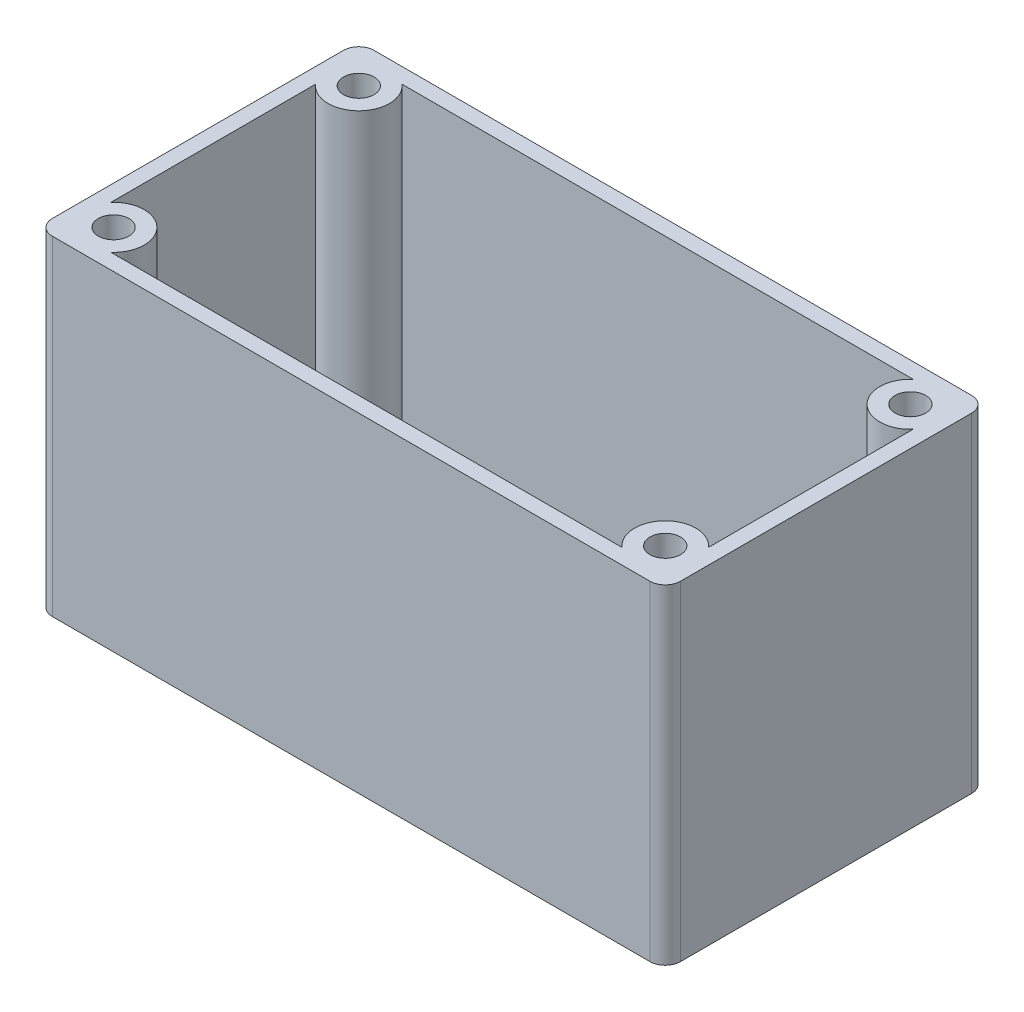
ISO-10303-21;
HEADER;
FILE_DESCRIPTION(('STEP AP214'),'2;1');
FILE_NAME('part.step','',(''),(''),'','','');
FILE_SCHEMA(('AUTOMOTIVE_DESIGN { 1 0 10303 214 1 1 1 1 }'));
ENDSEC;
DATA;
#1=APPLICATION_CONTEXT('core data for automotive mechanical design processes');
#2=APPLICATION_PROTOCOL_DEFINITION('international standard','automotive_design',2000,#1);
#3=PRODUCT_CONTEXT('',#1,'mechanical');
#4=PRODUCT('Part','Part','',(#3));
#5=PRODUCT_RELATED_PRODUCT_CATEGORY('part','',(#4));
#6=PRODUCT_DEFINITION_FORMATION('','',#4);
#7=PRODUCT_DEFINITION_CONTEXT('part definition',#1,'design');
#8=PRODUCT_DEFINITION('design','',#6,#7);
#9=PRODUCT_DEFINITION_SHAPE('','',#8);
#10=(LENGTH_UNIT() NAMED_UNIT(*) SI_UNIT(.MILLI.,.METRE.));
#11=(NAMED_UNIT(*) PLANE_ANGLE_UNIT() SI_UNIT($,.RADIAN.));
#12=(NAMED_UNIT(*) SI_UNIT($,.STERADIAN.) SOLID_ANGLE_UNIT());
#13=UNCERTAINTY_MEASURE_WITH_UNIT(LENGTH_MEASURE(1.E-05),#10,'distance_accuracy_value','');
#14=(GEOMETRIC_REPRESENTATION_CONTEXT(3) GLOBAL_UNCERTAINTY_ASSIGNED_CONTEXT((#13)) GLOBAL_UNIT_ASSIGNED_CONTEXT((#10,
#11,#12)) REPRESENTATION_CONTEXT('',''));
#15=CARTESIAN_POINT('',(0.,0.,0.));
#16=DIRECTION('',(0.,0.,1.));
#17=DIRECTION('',(1.,0.,0.));
#18=AXIS2_PLACEMENT_3D('',#15,#16,#17);
#19=CARTESIAN_POINT('',(1.,21.5,-20.));
#20=DIRECTION('',(0.,-1.,0.));
#21=DIRECTION('',(0.,0.,-1.));
#22=AXIS2_PLACEMENT_3D('',#19,#20,#21);
#23=PLANE('',#22);
#24=CARTESIAN_POINT('',(2.5,21.5,-18.5));
#25=DIRECTION('',(0.,1.,0.));
#26=DIRECTION('',(0.,0.,1.));
#27=AXIS2_PLACEMENT_3D('',#24,#25,#26);
#28=CIRCLE('',#27,1.);
#29=CARTESIAN_POINT('',(2.5,21.5,-17.5));
#30=VERTEX_POINT('',#29);
#31=EDGE_CURVE('E213',#30,#30,#28,.T.);
#32=ORIENTED_EDGE('',*,*,#31,.F.);
#33=EDGE_LOOP('',(#32));
#34=FACE_BOUND('',#33,.T.);
#35=CARTESIAN_POINT('',(1.,21.5,-20.));
#36=DIRECTION('',(0.,1.,0.));
#37=DIRECTION('',(0.,0.,-1.));
#38=AXIS2_PLACEMENT_3D('',#35,#36,#37);
#39=CIRCLE('',#38,1.);
#40=CARTESIAN_POINT('',(1.00000000000001,21.5,-21.));
#41=VERTEX_POINT('',#40);
#42=CARTESIAN_POINT('',(0.,21.5,-20.));
#43=VERTEX_POINT('',#42);
#44=EDGE_CURVE('E219',#41,#43,#39,.T.);
#45=ORIENTED_EDGE('',*,*,#44,.T.);
#46=DIRECTION('',(0.,0.,1.));
#47=VECTOR('',#46,1.);
#48=CARTESIAN_POINT('',(0.,21.5,-1.00000000000001));
#49=LINE('',#48,#47);
#50=CARTESIAN_POINT('',(0.,21.5,-1.00000000000001));
#51=VERTEX_POINT('',#50);
#52=EDGE_CURVE('E222',#43,#51,#49,.T.);
#53=ORIENTED_EDGE('',*,*,#52,.T.);
#54=CARTESIAN_POINT('',(1.,21.5,-1.));
#55=DIRECTION('',(0.,1.,0.));
#56=DIRECTION('',(0.,0.,-1.));
#57=AXIS2_PLACEMENT_3D('',#54,#55,#56);
#58=CIRCLE('',#57,1.);
#59=CARTESIAN_POINT('',(1.00000000000001,21.5,0.));
#60=VERTEX_POINT('',#59);
#61=EDGE_CURVE('E225',#51,#60,#58,.T.);
#62=ORIENTED_EDGE('',*,*,#61,.T.);
#63=DIRECTION('',(1.,0.,0.));
#64=VECTOR('',#63,1.);
#65=CARTESIAN_POINT('',(1.00000000000001,21.5,0.));
#66=LINE('',#65,#64);
#67=CARTESIAN_POINT('',(40.,21.5,0.));
#68=VERTEX_POINT('',#67);
#69=EDGE_CURVE('E227',#60,#68,#66,.T.);
#70=ORIENTED_EDGE('',*,*,#69,.T.);
#71=CARTESIAN_POINT('',(40.,21.5,-1.));
#72=DIRECTION('',(0.,1.,0.));
#73=DIRECTION('',(0.,0.,1.));
#74=AXIS2_PLACEMENT_3D('',#71,#72,#73);
#75=CIRCLE('',#74,1.);
#76=CARTESIAN_POINT('',(41.,21.5,-1.00000000000001));
#77=VERTEX_POINT('',#76);
#78=EDGE_CURVE('E229',#68,#77,#75,.T.);
#79=ORIENTED_EDGE('',*,*,#78,.T.);
#80=DIRECTION('',(0.,0.,-1.));
#81=VECTOR('',#80,1.);
#82=CARTESIAN_POINT('',(41.,21.5,-1.00000000000001));
#83=LINE('',#82,#81);
#84=CARTESIAN_POINT('',(41.,21.5,-20.));
#85=VERTEX_POINT('',#84);
#86=EDGE_CURVE('E231',#77,#85,#83,.T.);
#87=ORIENTED_EDGE('',*,*,#86,.T.);
#88=CARTESIAN_POINT('',(40.,21.5,-20.));
#89=DIRECTION('',(0.,1.,0.));
#90=DIRECTION('',(0.,0.,-1.));
#91=AXIS2_PLACEMENT_3D('',#88,#89,#90);
#92=CIRCLE('',#91,1.);
#93=CARTESIAN_POINT('',(40.,21.5,-21.));
#94=VERTEX_POINT('',#93);
#95=EDGE_CURVE('E233',#85,#94,#92,.T.);
#96=ORIENTED_EDGE('',*,*,#95,.T.);
#97=DIRECTION('',(-1.,0.,0.));
#98=VECTOR('',#97,1.);
#99=CARTESIAN_POINT('',(1.00000000000001,21.5,-21.));
#100=LINE('',#99,#98);
#101=EDGE_CURVE('E235',#94,#41,#100,.T.);
#102=ORIENTED_EDGE('',*,*,#101,.T.);
#103=EDGE_LOOP('',(#45,#53,#62,#70,#79,#87,#96,#102));
#104=FACE_BOUND('',#103,.T.);
#105=CARTESIAN_POINT('',(2.5,21.5,-18.5));
#106=DIRECTION('',(0.,-1.,0.));
#107=DIRECTION('',(0.,0.,1.));
#108=AXIS2_PLACEMENT_3D('',#105,#106,#107);
#109=CIRCLE('',#108,2.);
#110=CARTESIAN_POINT('',(3.8228756555323,21.5,-20.));
#111=VERTEX_POINT('',#110);
#112=CARTESIAN_POINT('',(1.,21.5,-17.1771243444677));
#113=VERTEX_POINT('',#112);
#114=EDGE_CURVE('E145',#111,#113,#109,.T.);
#115=ORIENTED_EDGE('',*,*,#114,.F.);
#116=DIRECTION('',(-1.,0.,0.));
#117=VECTOR('',#116,1.);
#118=CARTESIAN_POINT('',(3.8228756555323,21.5,-20.));
#119=LINE('',#118,#117);
#120=CARTESIAN_POINT('',(37.1771243444677,21.5,-20.));
#121=VERTEX_POINT('',#120);
#122=EDGE_CURVE('E180',#121,#111,#119,.T.);
#123=ORIENTED_EDGE('',*,*,#122,.F.);
#124=CARTESIAN_POINT('',(38.5,21.5,-18.5));
#125=DIRECTION('',(0.,-1.,0.));
#126=DIRECTION('',(0.,0.,1.));
#127=AXIS2_PLACEMENT_3D('',#124,#125,#126);
#128=CIRCLE('',#127,1.99999999999999);
#129=CARTESIAN_POINT('',(40.,21.5,-17.1771243444677));
#130=VERTEX_POINT('',#129);
#131=EDGE_CURVE('E178',#130,#121,#128,.T.);
#132=ORIENTED_EDGE('',*,*,#131,.F.);
#133=DIRECTION('',(0.,0.,-1.));
#134=VECTOR('',#133,1.);
#135=CARTESIAN_POINT('',(40.,21.5,-3.82287565553248));
#136=LINE('',#135,#134);
#137=CARTESIAN_POINT('',(40.,21.5,-3.82287565553248));
#138=VERTEX_POINT('',#137);
#139=EDGE_CURVE('E176',#138,#130,#136,.T.);
#140=ORIENTED_EDGE('',*,*,#139,.F.);
#141=CARTESIAN_POINT('',(38.5000000000002,21.5,-2.5));
#142=DIRECTION('',(0.,-1.,0.));
#143=DIRECTION('',(0.,0.,1.));
#144=AXIS2_PLACEMENT_3D('',#141,#142,#143);
#145=CIRCLE('',#144,2.);
#146=CARTESIAN_POINT('',(37.1771243444679,21.5,-1.00000000000001));
#147=VERTEX_POINT('',#146);
#148=EDGE_CURVE('E174',#147,#138,#145,.T.);
#149=ORIENTED_EDGE('',*,*,#148,.F.);
#150=DIRECTION('',(1.,0.,0.));
#151=VECTOR('',#150,1.);
#152=CARTESIAN_POINT('',(3.82287565553246,21.5,-1.));
#153=LINE('',#152,#151);
#154=CARTESIAN_POINT('',(3.82287565553246,21.5,-1.));
#155=VERTEX_POINT('',#154);
#156=EDGE_CURVE('E169',#155,#147,#153,.T.);
#157=ORIENTED_EDGE('',*,*,#156,.F.);
#158=CARTESIAN_POINT('',(2.50000000000017,21.5,-2.5));
#159=DIRECTION('',(0.,-1.,0.));
#160=DIRECTION('',(0.,0.,1.));
#161=AXIS2_PLACEMENT_3D('',#158,#159,#160);
#162=CIRCLE('',#161,2.);
#163=CARTESIAN_POINT('',(1.00000000000001,21.5,-3.82287565553212));
#164=VERTEX_POINT('',#163);
#165=EDGE_CURVE('E167',#164,#155,#162,.T.);
#166=ORIENTED_EDGE('',*,*,#165,.F.);
#167=DIRECTION('',(0.,0.,1.));
#168=VECTOR('',#167,1.);
#169=CARTESIAN_POINT('',(1.00000000000001,21.5,-3.82287565553212));
#170=LINE('',#169,#168);
#171=EDGE_CURVE('E153',#113,#164,#170,.T.);
#172=ORIENTED_EDGE('',*,*,#171,.F.);
#173=EDGE_LOOP('',(#115,#123,#132,#140,#149,#157,#166,#172));
#174=FACE_BOUND('',#173,.T.);
#175=CARTESIAN_POINT('',(38.5,21.5,-18.5));
#176=DIRECTION('',(0.,1.,0.));
#177=DIRECTION('',(0.,0.,1.));
#178=AXIS2_PLACEMENT_3D('',#175,#176,#177);
#179=CIRCLE('',#178,0.999999999999998);
#180=CARTESIAN_POINT('',(38.5,21.5,-17.5));
#181=VERTEX_POINT('',#180);
#182=EDGE_CURVE('E183',#181,#181,#179,.T.);
#183=ORIENTED_EDGE('',*,*,#182,.F.);
#184=EDGE_LOOP('',(#183));
#185=FACE_BOUND('',#184,.T.);
#186=CARTESIAN_POINT('',(38.5000000000002,21.5,-2.5));
#187=DIRECTION('',(0.,1.,0.));
#188=DIRECTION('',(0.,0.,1.));
#189=AXIS2_PLACEMENT_3D('',#186,#187,#188);
#190=CIRCLE('',#189,0.999999999999998);
#191=CARTESIAN_POINT('',(38.5000000000002,21.5,-1.5));
#192=VERTEX_POINT('',#191);
#193=EDGE_CURVE('E396',#192,#192,#190,.T.);
#194=ORIENTED_EDGE('',*,*,#193,.F.);
#195=EDGE_LOOP('',(#194));
#196=FACE_BOUND('',#195,.T.);
#197=CARTESIAN_POINT('',(2.50000000000017,21.5,-2.5));
#198=DIRECTION('',(0.,1.,0.));
#199=DIRECTION('',(0.,0.,1.));
#200=AXIS2_PLACEMENT_3D('',#197,#198,#199);
#201=CIRCLE('',#200,1.);
#202=CARTESIAN_POINT('',(2.50000000000017,21.5,-1.5));
#203=VERTEX_POINT('',#202);
#204=EDGE_CURVE('E387',#203,#203,#201,.T.);
#205=ORIENTED_EDGE('',*,*,#204,.F.);
#206=EDGE_LOOP('',(#205));
#207=FACE_BOUND('',#206,.T.);
#208=ADVANCED_FACE('F32',(#34,#104,#174,#185,#196,#207),#23,.F.);
#209=CARTESIAN_POINT('',(1.,0.,-20.));
#210=DIRECTION('',(0.,-1.,0.));
#211=DIRECTION('',(0.,0.,-1.));
#212=AXIS2_PLACEMENT_3D('',#209,#210,#211);
#213=PLANE('',#212);
#214=CARTESIAN_POINT('',(38.5000000000002,0.,-2.5));
#215=DIRECTION('',(0.,1.,0.));
#216=DIRECTION('',(0.,0.,1.));
#217=AXIS2_PLACEMENT_3D('',#214,#215,#216);
#218=CIRCLE('',#217,0.999999999999998);
#219=CARTESIAN_POINT('',(38.5000000000002,0.,-1.5));
#220=VERTEX_POINT('',#219);
#221=EDGE_CURVE('E393',#220,#220,#218,.T.);
#222=ORIENTED_EDGE('',*,*,#221,.T.);
#223=EDGE_LOOP('',(#222));
#224=FACE_BOUND('',#223,.T.);
#225=DIRECTION('',(-1.,0.,0.));
#226=VECTOR('',#225,1.);
#227=CARTESIAN_POINT('',(3.8228756555323,0.,-20.));
#228=LINE('',#227,#226);
#229=CARTESIAN_POINT('',(37.1771243444677,0.,-20.));
#230=VERTEX_POINT('',#229);
#231=CARTESIAN_POINT('',(3.8228756555323,0.,-20.));
#232=VERTEX_POINT('',#231);
#233=EDGE_CURVE('E154',#230,#232,#228,.T.);
#234=ORIENTED_EDGE('',*,*,#233,.T.);
#235=CARTESIAN_POINT('',(2.5,0.,-18.5));
#236=DIRECTION('',(0.,-1.,0.));
#237=DIRECTION('',(0.,0.,1.));
#238=AXIS2_PLACEMENT_3D('',#235,#236,#237);
#239=CIRCLE('',#238,2.);
#240=CARTESIAN_POINT('',(1.,0.,-17.1771243444677));
#241=VERTEX_POINT('',#240);
#242=EDGE_CURVE('E55',#232,#241,#239,.T.);
#243=ORIENTED_EDGE('',*,*,#242,.T.);
#244=DIRECTION('',(0.,0.,1.));
#245=VECTOR('',#244,1.);
#246=CARTESIAN_POINT('',(1.00000000000001,0.,-3.82287565553212));
#247=LINE('',#246,#245);
#248=CARTESIAN_POINT('',(1.00000000000001,0.,-3.82287565553212));
#249=VERTEX_POINT('',#248);
#250=EDGE_CURVE('E160',#241,#249,#247,.T.);
#251=ORIENTED_EDGE('',*,*,#250,.T.);
#252=CARTESIAN_POINT('',(2.50000000000017,0.,-2.5));
#253=DIRECTION('',(0.,-1.,0.));
#254=DIRECTION('',(0.,0.,1.));
#255=AXIS2_PLACEMENT_3D('',#252,#253,#254);
#256=CIRCLE('',#255,2.);
#257=CARTESIAN_POINT('',(3.82287565553246,0.,-1.));
#258=VERTEX_POINT('',#257);
#259=EDGE_CURVE('E185',#249,#258,#256,.T.);
#260=ORIENTED_EDGE('',*,*,#259,.T.);
#261=DIRECTION('',(1.,0.,0.));
#262=VECTOR('',#261,1.);
#263=CARTESIAN_POINT('',(3.82287565553246,0.,-1.));
#264=LINE('',#263,#262);
#265=CARTESIAN_POINT('',(37.1771243444679,0.,-1.00000000000001));
#266=VERTEX_POINT('',#265);
#267=EDGE_CURVE('E188',#258,#266,#264,.T.);
#268=ORIENTED_EDGE('',*,*,#267,.T.);
#269=CARTESIAN_POINT('',(38.5000000000002,0.,-2.5));
#270=DIRECTION('',(0.,-1.,0.));
#271=DIRECTION('',(0.,0.,1.));
#272=AXIS2_PLACEMENT_3D('',#269,#270,#271);
#273=CIRCLE('',#272,2.);
#274=CARTESIAN_POINT('',(40.,0.,-3.82287565553248));
#275=VERTEX_POINT('',#274);
#276=EDGE_CURVE('E191',#266,#275,#273,.T.);
#277=ORIENTED_EDGE('',*,*,#276,.T.);
#278=DIRECTION('',(0.,0.,-1.));
#279=VECTOR('',#278,1.);
#280=CARTESIAN_POINT('',(40.,0.,-3.82287565553248));
#281=LINE('',#280,#279);
#282=CARTESIAN_POINT('',(40.,0.,-17.1771243444677));
#283=VERTEX_POINT('',#282);
#284=EDGE_CURVE('E194',#275,#283,#281,.T.);
#285=ORIENTED_EDGE('',*,*,#284,.T.);
#286=CARTESIAN_POINT('',(38.5,0.,-18.5));
#287=DIRECTION('',(0.,-1.,0.));
#288=DIRECTION('',(0.,0.,1.));
#289=AXIS2_PLACEMENT_3D('',#286,#287,#288);
#290=CIRCLE('',#289,1.99999999999999);
#291=EDGE_CURVE('E197',#283,#230,#290,.T.);
#292=ORIENTED_EDGE('',*,*,#291,.T.);
#293=EDGE_LOOP('',(#234,#243,#251,#260,#268,#277,#285,#292));
#294=FACE_BOUND('',#293,.T.);
#295=CARTESIAN_POINT('',(2.5,0.,-18.5));
#296=DIRECTION('',(0.,1.,0.));
#297=DIRECTION('',(0.,0.,1.));
#298=AXIS2_PLACEMENT_3D('',#295,#296,#297);
#299=CIRCLE('',#298,1.);
#300=CARTESIAN_POINT('',(2.5,0.,-17.5));
#301=VERTEX_POINT('',#300);
#302=EDGE_CURVE('E161',#301,#301,#299,.T.);
#303=ORIENTED_EDGE('',*,*,#302,.T.);
#304=EDGE_LOOP('',(#303));
#305=FACE_BOUND('',#304,.T.);
#306=CARTESIAN_POINT('',(1.,0.,-20.));
#307=DIRECTION('',(0.,1.,0.));
#308=DIRECTION('',(0.,0.,-1.));
#309=AXIS2_PLACEMENT_3D('',#306,#307,#308);
#310=CIRCLE('',#309,1.);
#311=CARTESIAN_POINT('',(1.00000000000001,0.,-21.));
#312=VERTEX_POINT('',#311);
#313=CARTESIAN_POINT('',(0.,0.,-20.));
#314=VERTEX_POINT('',#313);
#315=EDGE_CURVE('E216',#312,#314,#310,.T.);
#316=ORIENTED_EDGE('',*,*,#315,.F.);
#317=DIRECTION('',(-1.,0.,0.));
#318=VECTOR('',#317,1.);
#319=CARTESIAN_POINT('',(1.00000000000001,0.,-21.));
#320=LINE('',#319,#318);
#321=CARTESIAN_POINT('',(40.,0.,-21.));
#322=VERTEX_POINT('',#321);
#323=EDGE_CURVE('E223',#322,#312,#320,.T.);
#324=ORIENTED_EDGE('',*,*,#323,.F.);
#325=CARTESIAN_POINT('',(40.,0.,-20.));
#326=DIRECTION('',(0.,1.,0.));
#327=DIRECTION('',(0.,0.,-1.));
#328=AXIS2_PLACEMENT_3D('',#325,#326,#327);
#329=CIRCLE('',#328,1.);
#330=CARTESIAN_POINT('',(41.,0.,-20.));
#331=VERTEX_POINT('',#330);
#332=EDGE_CURVE('E250',#331,#322,#329,.T.);
#333=ORIENTED_EDGE('',*,*,#332,.F.);
#334=DIRECTION('',(0.,0.,-1.));
#335=VECTOR('',#334,1.);
#336=CARTESIAN_POINT('',(41.,0.,-1.00000000000001));
#337=LINE('',#336,#335);
#338=CARTESIAN_POINT('',(41.,0.,-1.00000000000001));
#339=VERTEX_POINT('',#338);
#340=EDGE_CURVE('E248',#339,#331,#337,.T.);
#341=ORIENTED_EDGE('',*,*,#340,.F.);
#342=CARTESIAN_POINT('',(40.,0.,-1.));
#343=DIRECTION('',(0.,1.,0.));
#344=DIRECTION('',(0.,0.,1.));
#345=AXIS2_PLACEMENT_3D('',#342,#343,#344);
#346=CIRCLE('',#345,1.);
#347=CARTESIAN_POINT('',(40.,0.,0.));
#348=VERTEX_POINT('',#347);
#349=EDGE_CURVE('E246',#348,#339,#346,.T.);
#350=ORIENTED_EDGE('',*,*,#349,.F.);
#351=DIRECTION('',(1.,0.,0.));
#352=VECTOR('',#351,1.);
#353=CARTESIAN_POINT('',(1.00000000000001,0.,0.));
#354=LINE('',#353,#352);
#355=CARTESIAN_POINT('',(1.00000000000001,0.,0.));
#356=VERTEX_POINT('',#355);
#357=EDGE_CURVE('E244',#356,#348,#354,.T.);
#358=ORIENTED_EDGE('',*,*,#357,.F.);
#359=CARTESIAN_POINT('',(1.,0.,-1.));
#360=DIRECTION('',(0.,1.,0.));
#361=DIRECTION('',(0.,0.,-1.));
#362=AXIS2_PLACEMENT_3D('',#359,#360,#361);
#363=CIRCLE('',#362,1.);
#364=CARTESIAN_POINT('',(0.,0.,-1.00000000000001));
#365=VERTEX_POINT('',#364);
#366=EDGE_CURVE('E242',#365,#356,#363,.T.);
#367=ORIENTED_EDGE('',*,*,#366,.F.);
#368=DIRECTION('',(0.,0.,1.));
#369=VECTOR('',#368,1.);
#370=CARTESIAN_POINT('',(0.,0.,-1.00000000000001));
#371=LINE('',#370,#369);
#372=EDGE_CURVE('E240',#314,#365,#371,.T.);
#373=ORIENTED_EDGE('',*,*,#372,.F.);
#374=EDGE_LOOP('',(#316,#324,#333,#341,#350,#358,#367,#373));
#375=FACE_BOUND('',#374,.T.);
#376=CARTESIAN_POINT('',(38.5,0.,-18.5));
#377=DIRECTION('',(0.,1.,0.));
#378=DIRECTION('',(0.,0.,1.));
#379=AXIS2_PLACEMENT_3D('',#376,#377,#378);
#380=CIRCLE('',#379,0.999999999999998);
#381=CARTESIAN_POINT('',(38.5,0.,-17.5));
#382=VERTEX_POINT('',#381);
#383=EDGE_CURVE('E399',#382,#382,#380,.T.);
#384=ORIENTED_EDGE('',*,*,#383,.T.);
#385=EDGE_LOOP('',(#384));
#386=FACE_BOUND('',#385,.T.);
#387=CARTESIAN_POINT('',(2.50000000000017,0.,-2.5));
#388=DIRECTION('',(0.,1.,0.));
#389=DIRECTION('',(0.,0.,1.));
#390=AXIS2_PLACEMENT_3D('',#387,#388,#389);
#391=CIRCLE('',#390,1.);
#392=CARTESIAN_POINT('',(2.50000000000017,0.,-1.5));
#393=VERTEX_POINT('',#392);
#394=EDGE_CURVE('E390',#393,#393,#391,.T.);
#395=ORIENTED_EDGE('',*,*,#394,.T.);
#396=EDGE_LOOP('',(#395));
#397=FACE_BOUND('',#396,.T.);
#398=ADVANCED_FACE('F280',(#224,#294,#305,#375,#386,#397),#213,.T.);
#399=CARTESIAN_POINT('',(1.,21.5,-20.));
#400=DIRECTION('',(0.,-1.,0.));
#401=DIRECTION('',(0.,0.,-1.));
#402=AXIS2_PLACEMENT_3D('',#399,#400,#401);
#403=CYLINDRICAL_SURFACE('',#402,1.);
#404=ORIENTED_EDGE('',*,*,#315,.T.);
#405=DIRECTION('',(0.,-1.,0.));
#406=VECTOR('',#405,1.);
#407=CARTESIAN_POINT('',(0.,21.5,-20.));
#408=LINE('',#407,#406);
#409=EDGE_CURVE('E11',#43,#314,#408,.T.);
#410=ORIENTED_EDGE('',*,*,#409,.F.);
#411=ORIENTED_EDGE('',*,*,#44,.F.);
#412=DIRECTION('',(0.,-1.,0.));
#413=VECTOR('',#412,1.);
#414=CARTESIAN_POINT('',(1.00000000000001,21.5,-21.));
#415=LINE('',#414,#413);
#416=EDGE_CURVE('E237',#41,#312,#415,.T.);
#417=ORIENTED_EDGE('',*,*,#416,.T.);
#418=EDGE_LOOP('',(#404,#410,#411,#417));
#419=FACE_BOUND('',#418,.T.);
#420=ADVANCED_FACE('F34',(#419),#403,.T.);
#421=CARTESIAN_POINT('',(0.,21.5,-1.00000000000001));
#422=DIRECTION('',(1.,0.,0.));
#423=DIRECTION('',(0.,0.,-1.));
#424=AXIS2_PLACEMENT_3D('',#421,#422,#423);
#425=PLANE('',#424);
#426=ORIENTED_EDGE('',*,*,#372,.T.);
#427=DIRECTION('',(0.,-1.,0.));
#428=VECTOR('',#427,1.);
#429=CARTESIAN_POINT('',(0.,21.5,-1.00000000000001));
#430=LINE('',#429,#428);
#431=EDGE_CURVE('E40',#51,#365,#430,.T.);
#432=ORIENTED_EDGE('',*,*,#431,.F.);
#433=ORIENTED_EDGE('',*,*,#52,.F.);
#434=ORIENTED_EDGE('',*,*,#409,.T.);
#435=EDGE_LOOP('',(#426,#432,#433,#434));
#436=FACE_BOUND('',#435,.T.);
#437=ADVANCED_FACE('F297',(#436),#425,.F.);
#438=CARTESIAN_POINT('',(1.,21.5,-1.));
#439=DIRECTION('',(0.,-1.,0.));
#440=DIRECTION('',(0.,0.,-1.));
#441=AXIS2_PLACEMENT_3D('',#438,#439,#440);
#442=CYLINDRICAL_SURFACE('',#441,1.);
#443=ORIENTED_EDGE('',*,*,#366,.T.);
#444=DIRECTION('',(0.,-1.,0.));
#445=VECTOR('',#444,1.);
#446=CARTESIAN_POINT('',(1.00000000000001,21.5,0.));
#447=LINE('',#446,#445);
#448=EDGE_CURVE('E267',#60,#356,#447,.T.);
#449=ORIENTED_EDGE('',*,*,#448,.F.);
#450=ORIENTED_EDGE('',*,*,#61,.F.);
#451=ORIENTED_EDGE('',*,*,#431,.T.);
#452=EDGE_LOOP('',(#443,#449,#450,#451));
#453=FACE_BOUND('',#452,.T.);
#454=ADVANCED_FACE('F274',(#453),#442,.T.);
#455=CARTESIAN_POINT('',(1.00000000000001,21.5,0.));
#456=DIRECTION('',(0.,0.,-1.));
#457=DIRECTION('',(-1.,0.,0.));
#458=AXIS2_PLACEMENT_3D('',#455,#456,#457);
#459=PLANE('',#458);
#460=ORIENTED_EDGE('',*,*,#357,.T.);
#461=DIRECTION('',(0.,-1.,0.));
#462=VECTOR('',#461,1.);
#463=CARTESIAN_POINT('',(40.,21.5,0.));
#464=LINE('',#463,#462);
#465=EDGE_CURVE('E264',#68,#348,#464,.T.);
#466=ORIENTED_EDGE('',*,*,#465,.F.);
#467=ORIENTED_EDGE('',*,*,#69,.F.);
#468=ORIENTED_EDGE('',*,*,#448,.T.);
#469=EDGE_LOOP('',(#460,#466,#467,#468));
#470=FACE_BOUND('',#469,.T.);
#471=ADVANCED_FACE('F286',(#470),#459,.F.);
#472=CARTESIAN_POINT('',(40.,21.5,-1.));
#473=DIRECTION('',(0.,-1.,0.));
#474=DIRECTION('',(0.,0.,-1.));
#475=AXIS2_PLACEMENT_3D('',#472,#473,#474);
#476=CYLINDRICAL_SURFACE('',#475,1.);
#477=ORIENTED_EDGE('',*,*,#349,.T.);
#478=DIRECTION('',(0.,-1.,0.));
#479=VECTOR('',#478,1.);
#480=CARTESIAN_POINT('',(41.,21.5,-1.00000000000001));
#481=LINE('',#480,#479);
#482=EDGE_CURVE('E261',#77,#339,#481,.T.);
#483=ORIENTED_EDGE('',*,*,#482,.F.);
#484=ORIENTED_EDGE('',*,*,#78,.F.);
#485=ORIENTED_EDGE('',*,*,#465,.T.);
#486=EDGE_LOOP('',(#477,#483,#484,#485));
#487=FACE_BOUND('',#486,.T.);
#488=ADVANCED_FACE('F290',(#487),#476,.T.);
#489=CARTESIAN_POINT('',(41.,21.5,-1.00000000000001));
#490=DIRECTION('',(-1.,0.,0.));
#491=DIRECTION('',(0.,0.,1.));
#492=AXIS2_PLACEMENT_3D('',#489,#490,#491);
#493=PLANE('',#492);
#494=ORIENTED_EDGE('',*,*,#340,.T.);
#495=DIRECTION('',(0.,-1.,0.));
#496=VECTOR('',#495,1.);
#497=CARTESIAN_POINT('',(41.,21.5,-20.));
#498=LINE('',#497,#496);
#499=EDGE_CURVE('E258',#85,#331,#498,.T.);
#500=ORIENTED_EDGE('',*,*,#499,.F.);
#501=ORIENTED_EDGE('',*,*,#86,.F.);
#502=ORIENTED_EDGE('',*,*,#482,.T.);
#503=EDGE_LOOP('',(#494,#500,#501,#502));
#504=FACE_BOUND('',#503,.T.);
#505=ADVANCED_FACE('F310',(#504),#493,.F.);
#506=CARTESIAN_POINT('',(40.,21.5,-20.));
#507=DIRECTION('',(0.,-1.,0.));
#508=DIRECTION('',(0.,0.,-1.));
#509=AXIS2_PLACEMENT_3D('',#506,#507,#508);
#510=CYLINDRICAL_SURFACE('',#509,1.);
#511=ORIENTED_EDGE('',*,*,#332,.T.);
#512=DIRECTION('',(0.,-1.,0.));
#513=VECTOR('',#512,1.);
#514=CARTESIAN_POINT('',(40.,21.5,-21.));
#515=LINE('',#514,#513);
#516=EDGE_CURVE('E255',#94,#322,#515,.T.);
#517=ORIENTED_EDGE('',*,*,#516,.F.);
#518=ORIENTED_EDGE('',*,*,#95,.F.);
#519=ORIENTED_EDGE('',*,*,#499,.T.);
#520=EDGE_LOOP('',(#511,#517,#518,#519));
#521=FACE_BOUND('',#520,.T.);
#522=ADVANCED_FACE('F308',(#521),#510,.T.);
#523=CARTESIAN_POINT('',(1.00000000000001,21.5,-21.));
#524=DIRECTION('',(0.,0.,1.));
#525=DIRECTION('',(1.,0.,0.));
#526=AXIS2_PLACEMENT_3D('',#523,#524,#525);
#527=PLANE('',#526);
#528=ORIENTED_EDGE('',*,*,#323,.T.);
#529=ORIENTED_EDGE('',*,*,#416,.F.);
#530=ORIENTED_EDGE('',*,*,#101,.F.);
#531=ORIENTED_EDGE('',*,*,#516,.T.);
#532=EDGE_LOOP('',(#528,#529,#530,#531));
#533=FACE_BOUND('',#532,.T.);
#534=ADVANCED_FACE('F303',(#533),#527,.F.);
#535=CARTESIAN_POINT('',(2.5,21.5,-18.5));
#536=DIRECTION('',(0.,-1.,0.));
#537=DIRECTION('',(0.,0.,-1.));
#538=AXIS2_PLACEMENT_3D('',#535,#536,#537);
#539=CYLINDRICAL_SURFACE('',#538,1.);
#540=ORIENTED_EDGE('',*,*,#31,.T.);
#541=EDGE_LOOP('',(#540));
#542=FACE_BOUND('',#541,.T.);
#543=ORIENTED_EDGE('',*,*,#302,.F.);
#544=EDGE_LOOP('',(#543));
#545=FACE_BOUND('',#544,.T.);
#546=ADVANCED_FACE('F329',(#542,#545),#539,.F.);
#547=CARTESIAN_POINT('',(2.5,21.5,-18.5));
#548=DIRECTION('',(0.,-1.,0.));
#549=DIRECTION('',(0.,0.,-1.));
#550=AXIS2_PLACEMENT_3D('',#547,#548,#549);
#551=CYLINDRICAL_SURFACE('',#550,2.);
#552=ORIENTED_EDGE('',*,*,#242,.F.);
#553=DIRECTION('',(0.,-1.,0.));
#554=VECTOR('',#553,1.);
#555=CARTESIAN_POINT('',(3.8228756555323,21.5,-20.));
#556=LINE('',#555,#554);
#557=EDGE_CURVE('E149',#111,#232,#556,.T.);
#558=ORIENTED_EDGE('',*,*,#557,.F.);
#559=ORIENTED_EDGE('',*,*,#114,.T.);
#560=DIRECTION('',(0.,-1.,0.));
#561=VECTOR('',#560,1.);
#562=CARTESIAN_POINT('',(1.,21.5,-17.1771243444677));
#563=LINE('',#562,#561);
#564=EDGE_CURVE('E148',#113,#241,#563,.T.);
#565=ORIENTED_EDGE('',*,*,#564,.T.);
#566=EDGE_LOOP('',(#552,#558,#559,#565));
#567=FACE_BOUND('',#566,.T.);
#568=ADVANCED_FACE('F147',(#567),#551,.T.);
#569=CARTESIAN_POINT('',(1.00000000000001,21.5,-3.82287565553212));
#570=DIRECTION('',(1.,0.,0.));
#571=DIRECTION('',(0.,0.,-1.));
#572=AXIS2_PLACEMENT_3D('',#569,#570,#571);
#573=PLANE('',#572);
#574=ORIENTED_EDGE('',*,*,#250,.F.);
#575=ORIENTED_EDGE('',*,*,#564,.F.);
#576=ORIENTED_EDGE('',*,*,#171,.T.);
#577=DIRECTION('',(0.,-1.,0.));
#578=VECTOR('',#577,1.);
#579=CARTESIAN_POINT('',(1.00000000000001,21.5,-3.82287565553212));
#580=LINE('',#579,#578);
#581=EDGE_CURVE('E162',#164,#249,#580,.T.);
#582=ORIENTED_EDGE('',*,*,#581,.T.);
#583=EDGE_LOOP('',(#574,#575,#576,#582));
#584=FACE_BOUND('',#583,.T.);
#585=ADVANCED_FACE('F157',(#584),#573,.T.);
#586=CARTESIAN_POINT('',(2.50000000000017,21.5,-2.5));
#587=DIRECTION('',(0.,-1.,0.));
#588=DIRECTION('',(0.,0.,-1.));
#589=AXIS2_PLACEMENT_3D('',#586,#587,#588);
#590=CYLINDRICAL_SURFACE('',#589,2.);
#591=ORIENTED_EDGE('',*,*,#259,.F.);
#592=ORIENTED_EDGE('',*,*,#581,.F.);
#593=ORIENTED_EDGE('',*,*,#165,.T.);
#594=DIRECTION('',(0.,-1.,0.));
#595=VECTOR('',#594,1.);
#596=CARTESIAN_POINT('',(3.82287565553246,21.5,-1.));
#597=LINE('',#596,#595);
#598=EDGE_CURVE('E210',#155,#258,#597,.T.);
#599=ORIENTED_EDGE('',*,*,#598,.T.);
#600=EDGE_LOOP('',(#591,#592,#593,#599));
#601=FACE_BOUND('',#600,.T.);
#602=ADVANCED_FACE('F346',(#601),#590,.T.);
#603=CARTESIAN_POINT('',(3.82287565553246,21.5,-1.));
#604=DIRECTION('',(0.,0.,-1.));
#605=DIRECTION('',(-1.,0.,0.));
#606=AXIS2_PLACEMENT_3D('',#603,#604,#605);
#607=PLANE('',#606);
#608=ORIENTED_EDGE('',*,*,#267,.F.);
#609=ORIENTED_EDGE('',*,*,#598,.F.);
#610=ORIENTED_EDGE('',*,*,#156,.T.);
#611=DIRECTION('',(0.,-1.,0.));
#612=VECTOR('',#611,1.);
#613=CARTESIAN_POINT('',(37.1771243444679,21.5,-1.00000000000001));
#614=LINE('',#613,#612);
#615=EDGE_CURVE('E208',#147,#266,#614,.T.);
#616=ORIENTED_EDGE('',*,*,#615,.T.);
#617=EDGE_LOOP('',(#608,#609,#610,#616));
#618=FACE_BOUND('',#617,.T.);
#619=ADVANCED_FACE('F351',(#618),#607,.T.);
#620=CARTESIAN_POINT('',(38.5000000000002,21.5,-2.5));
#621=DIRECTION('',(0.,-1.,0.));
#622=DIRECTION('',(0.,0.,-1.));
#623=AXIS2_PLACEMENT_3D('',#620,#621,#622);
#624=CYLINDRICAL_SURFACE('',#623,2.);
#625=ORIENTED_EDGE('',*,*,#276,.F.);
#626=ORIENTED_EDGE('',*,*,#615,.F.);
#627=ORIENTED_EDGE('',*,*,#148,.T.);
#628=DIRECTION('',(0.,-1.,0.));
#629=VECTOR('',#628,1.);
#630=CARTESIAN_POINT('',(40.,21.5,-3.82287565553248));
#631=LINE('',#630,#629);
#632=EDGE_CURVE('E206',#138,#275,#631,.T.);
#633=ORIENTED_EDGE('',*,*,#632,.T.);
#634=EDGE_LOOP('',(#625,#626,#627,#633));
#635=FACE_BOUND('',#634,.T.);
#636=ADVANCED_FACE('F355',(#635),#624,.T.);
#637=CARTESIAN_POINT('',(40.,21.5,-3.82287565553248));
#638=DIRECTION('',(-1.,0.,0.));
#639=DIRECTION('',(0.,0.,1.));
#640=AXIS2_PLACEMENT_3D('',#637,#638,#639);
#641=PLANE('',#640);
#642=ORIENTED_EDGE('',*,*,#284,.F.);
#643=ORIENTED_EDGE('',*,*,#632,.F.);
#644=ORIENTED_EDGE('',*,*,#139,.T.);
#645=DIRECTION('',(0.,-1.,0.));
#646=VECTOR('',#645,1.);
#647=CARTESIAN_POINT('',(40.,21.5,-17.1771243444677));
#648=LINE('',#647,#646);
#649=EDGE_CURVE('E204',#130,#283,#648,.T.);
#650=ORIENTED_EDGE('',*,*,#649,.T.);
#651=EDGE_LOOP('',(#642,#643,#644,#650));
#652=FACE_BOUND('',#651,.T.);
#653=ADVANCED_FACE('F359',(#652),#641,.T.);
#654=CARTESIAN_POINT('',(38.5,21.5,-18.5));
#655=DIRECTION('',(0.,-1.,0.));
#656=DIRECTION('',(0.,0.,-1.));
#657=AXIS2_PLACEMENT_3D('',#654,#655,#656);
#658=CYLINDRICAL_SURFACE('',#657,1.99999999999999);
#659=ORIENTED_EDGE('',*,*,#291,.F.);
#660=ORIENTED_EDGE('',*,*,#649,.F.);
#661=ORIENTED_EDGE('',*,*,#131,.T.);
#662=DIRECTION('',(0.,-1.,0.));
#663=VECTOR('',#662,1.);
#664=CARTESIAN_POINT('',(37.1771243444677,21.5,-20.));
#665=LINE('',#664,#663);
#666=EDGE_CURVE('E47',#121,#230,#665,.T.);
#667=ORIENTED_EDGE('',*,*,#666,.T.);
#668=EDGE_LOOP('',(#659,#660,#661,#667));
#669=FACE_BOUND('',#668,.T.);
#670=ADVANCED_FACE('F363',(#669),#658,.T.);
#671=CARTESIAN_POINT('',(3.8228756555323,21.5,-20.));
#672=DIRECTION('',(0.,0.,1.));
#673=DIRECTION('',(1.,0.,0.));
#674=AXIS2_PLACEMENT_3D('',#671,#672,#673);
#675=PLANE('',#674);
#676=ORIENTED_EDGE('',*,*,#233,.F.);
#677=ORIENTED_EDGE('',*,*,#666,.F.);
#678=ORIENTED_EDGE('',*,*,#122,.T.);
#679=ORIENTED_EDGE('',*,*,#557,.T.);
#680=EDGE_LOOP('',(#676,#677,#678,#679));
#681=FACE_BOUND('',#680,.T.);
#682=ADVANCED_FACE('F367',(#681),#675,.T.);
#683=CARTESIAN_POINT('',(38.5,21.5,-18.5));
#684=DIRECTION('',(0.,-1.,0.));
#685=DIRECTION('',(0.,0.,-1.));
#686=AXIS2_PLACEMENT_3D('',#683,#684,#685);
#687=CYLINDRICAL_SURFACE('',#686,0.999999999999998);
#688=ORIENTED_EDGE('',*,*,#182,.T.);
#689=EDGE_LOOP('',(#688));
#690=FACE_BOUND('',#689,.T.);
#691=ORIENTED_EDGE('',*,*,#383,.F.);
#692=EDGE_LOOP('',(#691));
#693=FACE_BOUND('',#692,.T.);
#694=ADVANCED_FACE('F371',(#690,#693),#687,.F.);
#695=CARTESIAN_POINT('',(38.5000000000002,21.5,-2.5));
#696=DIRECTION('',(0.,-1.,0.));
#697=DIRECTION('',(0.,0.,-1.));
#698=AXIS2_PLACEMENT_3D('',#695,#696,#697);
#699=CYLINDRICAL_SURFACE('',#698,0.999999999999998);
#700=ORIENTED_EDGE('',*,*,#193,.T.);
#701=EDGE_LOOP('',(#700));
#702=FACE_BOUND('',#701,.T.);
#703=ORIENTED_EDGE('',*,*,#221,.F.);
#704=EDGE_LOOP('',(#703));
#705=FACE_BOUND('',#704,.T.);
#706=ADVANCED_FACE('F374',(#702,#705),#699,.F.);
#707=CARTESIAN_POINT('',(2.50000000000017,21.5,-2.5));
#708=DIRECTION('',(0.,-1.,0.));
#709=DIRECTION('',(0.,0.,-1.));
#710=AXIS2_PLACEMENT_3D('',#707,#708,#709);
#711=CYLINDRICAL_SURFACE('',#710,1.);
#712=ORIENTED_EDGE('',*,*,#204,.T.);
#713=EDGE_LOOP('',(#712));
#714=FACE_BOUND('',#713,.T.);
#715=ORIENTED_EDGE('',*,*,#394,.F.);
#716=EDGE_LOOP('',(#715));
#717=FACE_BOUND('',#716,.T.);
#718=ADVANCED_FACE('F378',(#714,#717),#711,.F.);
#719=CLOSED_SHELL('',(#208,#398,#420,#437,#454,#471,#488,#505,#522,#534,#546,#568,#585,#602,
#619,#636,#653,#670,#682,#694,#706,#718));
#720=MANIFOLD_SOLID_BREP('B2',#719);
#721=ADVANCED_BREP_SHAPE_REPRESENTATION('',(#18,#720),#14);
#722=SHAPE_DEFINITION_REPRESENTATION(#9,#721);
ENDSEC;
END-ISO-10303-21;
